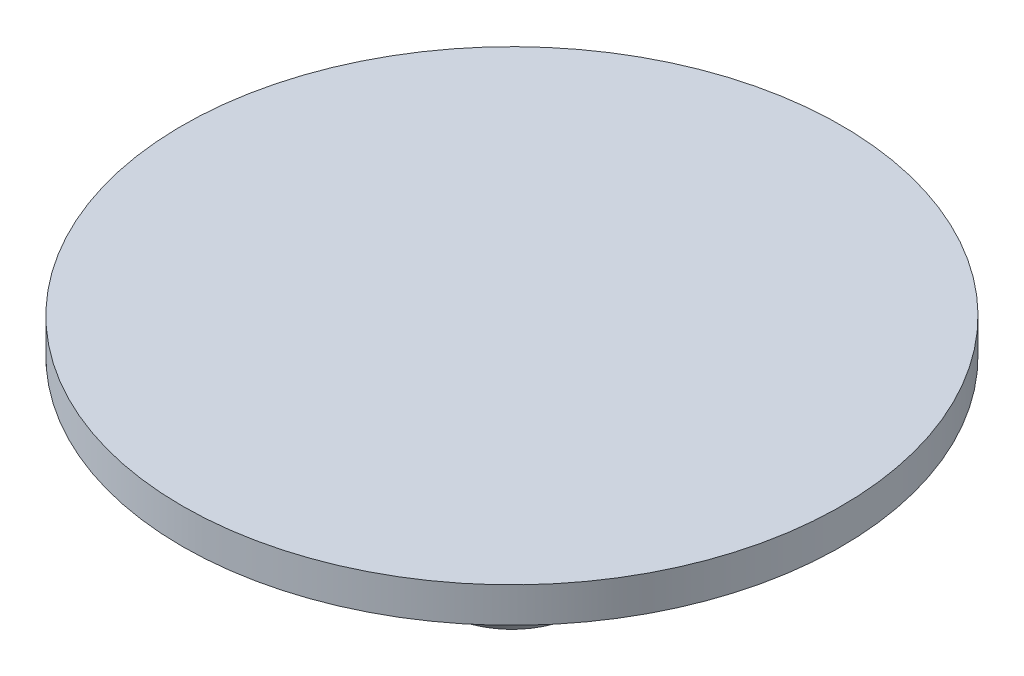
ISO-10303-21;
HEADER;
FILE_DESCRIPTION(('STEP AP214'),'2;1');
FILE_NAME('part.step','',(''),(''),'','','');
FILE_SCHEMA(('AUTOMOTIVE_DESIGN { 1 0 10303 214 1 1 1 1 }'));
ENDSEC;
DATA;
#1=APPLICATION_CONTEXT('core data for automotive mechanical design processes');
#2=APPLICATION_PROTOCOL_DEFINITION('international standard','automotive_design',2000,#1);
#3=PRODUCT_CONTEXT('',#1,'mechanical');
#4=PRODUCT('Part','Part','',(#3));
#5=PRODUCT_RELATED_PRODUCT_CATEGORY('part','',(#4));
#6=PRODUCT_DEFINITION_FORMATION('','',#4);
#7=PRODUCT_DEFINITION_CONTEXT('part definition',#1,'design');
#8=PRODUCT_DEFINITION('design','',#6,#7);
#9=PRODUCT_DEFINITION_SHAPE('','',#8);
#10=(LENGTH_UNIT() NAMED_UNIT(*) SI_UNIT(.MILLI.,.METRE.));
#11=(NAMED_UNIT(*) PLANE_ANGLE_UNIT() SI_UNIT($,.RADIAN.));
#12=(NAMED_UNIT(*) SI_UNIT($,.STERADIAN.) SOLID_ANGLE_UNIT());
#13=UNCERTAINTY_MEASURE_WITH_UNIT(LENGTH_MEASURE(1.E-05),#10,'distance_accuracy_value','');
#14=(GEOMETRIC_REPRESENTATION_CONTEXT(3) GLOBAL_UNCERTAINTY_ASSIGNED_CONTEXT((#13)) GLOBAL_UNIT_ASSIGNED_CONTEXT((#10,
#11,#12)) REPRESENTATION_CONTEXT('',''));
#15=CARTESIAN_POINT('',(0.,0.,0.));
#16=DIRECTION('',(0.,0.,1.));
#17=DIRECTION('',(1.,0.,0.));
#18=AXIS2_PLACEMENT_3D('',#15,#16,#17);
#19=CARTESIAN_POINT('',(14.1,0.,0.));
#20=DIRECTION('',(0.,-1.,0.));
#21=DIRECTION('',(0.,0.,-1.));
#22=AXIS2_PLACEMENT_3D('',#19,#20,#21);
#23=PLANE('',#22);
#24=CARTESIAN_POINT('',(0.,0.,0.));
#25=DIRECTION('',(0.,1.,0.));
#26=DIRECTION('',(0.,0.,1.));
#27=AXIS2_PLACEMENT_3D('',#24,#25,#26);
#28=CIRCLE('',#27,14.1);
#29=CARTESIAN_POINT('',(0.,0.,14.1));
#30=VERTEX_POINT('',#29);
#31=EDGE_CURVE('E68',#30,#30,#28,.T.);
#32=ORIENTED_EDGE('',*,*,#31,.T.);
#33=EDGE_LOOP('',(#32));
#34=FACE_BOUND('',#33,.T.);
#35=ADVANCED_FACE('F41',(#34),#23,.F.);
#36=CARTESIAN_POINT('',(0.,-1.5,0.));
#37=DIRECTION('',(0.,1.,0.));
#38=DIRECTION('',(0.,0.,1.));
#39=AXIS2_PLACEMENT_3D('',#36,#37,#38);
#40=PLANE('',#39);
#41=CARTESIAN_POINT('',(0.,-1.5,0.));
#42=DIRECTION('',(0.,1.,0.));
#43=DIRECTION('',(0.,0.,1.));
#44=AXIS2_PLACEMENT_3D('',#41,#42,#43);
#45=CIRCLE('',#44,2.);
#46=CARTESIAN_POINT('',(0.,-1.5,2.));
#47=VERTEX_POINT('',#46);
#48=EDGE_CURVE('E10',#47,#47,#45,.T.);
#49=ORIENTED_EDGE('',*,*,#48,.F.);
#50=EDGE_LOOP('',(#49));
#51=FACE_BOUND('',#50,.T.);
#52=ADVANCED_FACE('F104',(#51),#40,.F.);
#53=CARTESIAN_POINT('',(0.,0.,0.));
#54=DIRECTION('',(0.,1.,0.));
#55=DIRECTION('',(0.,0.,1.));
#56=AXIS2_PLACEMENT_3D('',#53,#54,#55);
#57=CYLINDRICAL_SURFACE('',#56,2.);
#58=CARTESIAN_POINT('',(1.25,-5.6,-1.5612494995996));
#59=CARTESIAN_POINT('',(1.24999462210485,-5.66212028180293,-1.56125800072559));
#60=CARTESIAN_POINT('',(1.24532693849666,-5.72433783537025,-1.56502642708837));
#61=CARTESIAN_POINT('',(1.22698950832934,-5.84667632007938,-1.57943717205478));
#62=CARTESIAN_POINT('',(1.21329530430551,-5.90679108636524,-1.59009816464115));
#63=CARTESIAN_POINT('',(1.17788073911871,-6.02278232269884,-1.61650085329041));
#64=CARTESIAN_POINT('',(1.15622993332784,-6.07869060868181,-1.63219837418033));
#65=CARTESIAN_POINT('',(1.10571945561924,-6.18600886163815,-1.66682950714432));
#66=CARTESIAN_POINT('',(1.07685958706091,-6.2374187058565,-1.68576320748676));
#67=CARTESIAN_POINT('',(1.00823937928364,-6.34186515447698,-1.72779611374711));
#68=CARTESIAN_POINT('',(0.967536093692503,-6.39419474083259,-1.75111338227346));
#69=CARTESIAN_POINT('',(0.87830866449688,-6.49188269914497,-1.79752820854877));
#70=CARTESIAN_POINT('',(0.829777781297414,-6.53723499728392,-1.82062555863329));
#71=CARTESIAN_POINT('',(0.719186665258492,-6.62510358514812,-1.86729453891009));
#72=CARTESIAN_POINT('',(0.656200568910557,-6.6666176681043,-1.8905872224145));
#73=CARTESIAN_POINT('',(0.522404070837316,-6.73812520476316,-1.9318323169914));
#74=CARTESIAN_POINT('',(0.451601506478242,-6.76813006575125,-1.94979001179838));
#75=CARTESIAN_POINT('',(0.311776878362019,-6.81248231060706,-1.97669841318201));
#76=CARTESIAN_POINT('',(0.243305636047242,-6.82811141639693,-1.98637922422038));
#77=CARTESIAN_POINT('',(0.104105100662264,-6.8476320696434,-1.99850544379202));
#78=CARTESIAN_POINT('',(0.0333782605640278,-6.85153595612055,-2.00095845843657));
#79=CARTESIAN_POINT('',(-0.0980658284213394,-6.84764431072239,-1.99852909107528));
#80=CARTESIAN_POINT('',(-0.158852523273785,-6.8413486236991,-1.99458699811902));
#81=CARTESIAN_POINT('',(-0.278306645903669,-6.82013301563668,-1.98145272261225));
#82=CARTESIAN_POINT('',(-0.336973913146973,-6.80521244276248,-1.97226014325117));
#83=CARTESIAN_POINT('',(-0.450889117077072,-6.76739622490288,-1.94938133614675));
#84=CARTESIAN_POINT('',(-0.506127875493232,-6.74448017595141,-1.93568361673912));
#85=CARTESIAN_POINT('',(-0.612019220469381,-6.69153124474001,-1.90485632889331));
#86=CARTESIAN_POINT('',(-0.66267075856,-6.6614967411094,-1.88772597874226));
#87=CARTESIAN_POINT('',(-0.764713515567041,-6.59097183467063,-1.84893224750793));
#88=CARTESIAN_POINT('',(-0.815412344918949,-6.54964537325767,-1.82697004307144));
#89=CARTESIAN_POINT('',(-0.909598595905498,-6.45986761977663,-1.78195462752237));
#90=CARTESIAN_POINT('',(-0.953075338789632,-6.41140597355345,-1.75889986449171));
#91=CARTESIAN_POINT('',(-1.03735445892931,-6.3012943770939,-1.71071442112196));
#92=CARTESIAN_POINT('',(-1.07706615479946,-6.2387486191497,-1.68570581533195));
#93=CARTESIAN_POINT('',(-1.14526153203309,-6.10635388022657,-1.640141390954));
#94=CARTESIAN_POINT('',(-1.17376589603358,-6.03651865604459,-1.6195774019168));
#95=CARTESIAN_POINT('',(-1.21218566853166,-5.91023059711213,-1.5909187656712));
#96=CARTESIAN_POINT('',(-1.22501841721721,-5.85508903736233,-1.58096704305272));
#97=CARTESIAN_POINT('',(-1.24310168537523,-5.74288481125107,-1.56679138875765));
#98=CARTESIAN_POINT('',(-1.24836256353275,-5.6858248789601,-1.56255963237428));
#99=CARTESIAN_POINT('',(-1.25098535954508,-5.57127131945973,-1.56046133530164));
#100=CARTESIAN_POINT('',(-1.24832917576576,-5.51377699863418,-1.56260938140435));
#101=CARTESIAN_POINT('',(-1.23525733555987,-5.4002194189684,-1.57296042862705));
#102=CARTESIAN_POINT('',(-1.22483525320262,-5.34415738503708,-1.58116844404657));
#103=CARTESIAN_POINT('',(-1.1970493572483,-5.2357816161342,-1.60230060601957));
#104=CARTESIAN_POINT('',(-1.17980280626788,-5.18342132666849,-1.61514477937171));
#105=CARTESIAN_POINT('',(-1.13902451938523,-5.08221266544302,-1.64415573440841));
#106=CARTESIAN_POINT('',(-1.11549055271421,-5.03336554797551,-1.66032369489908));
#107=CARTESIAN_POINT('',(-1.0576537677232,-4.93069396082297,-1.69787203988937));
#108=CARTESIAN_POINT('',(-1.02215373814221,-4.87769245875068,-1.71965875738289));
#109=CARTESIAN_POINT('',(-0.943690263224865,-4.77781494756085,-1.76393958000711));
#110=CARTESIAN_POINT('',(-0.900719074496603,-4.73094538302204,-1.78643439903354));
#111=CARTESIAN_POINT('',(-0.800380659499197,-4.63701675375685,-1.83383164018972));
#112=CARTESIAN_POINT('',(-0.741809949714167,-4.59113144299232,-1.85854204787597));
#113=CARTESIAN_POINT('',(-0.616299987869581,-4.50993134812414,-1.90384248964999));
#114=CARTESIAN_POINT('',(-0.549364678748665,-4.47461161002636,-1.92443445329132));
#115=CARTESIAN_POINT('',(-0.412925900636603,-4.41800500879736,-1.95809255957561));
#116=CARTESIAN_POINT('',(-0.343814822544522,-4.39600579352924,-1.9715348458918));
#117=CARTESIAN_POINT('',(-0.201860998884749,-4.36427333131891,-1.9910701008804));
#118=CARTESIAN_POINT('',(-0.12902356323837,-4.35452311023889,-1.99717323933003));
#119=CARTESIAN_POINT('',(0.00659907199680948,-4.34845347996121,-2.00096685748559));
#120=CARTESIAN_POINT('',(0.0692812975954716,-4.35036422321301,-1.99976600623617));
#121=CARTESIAN_POINT('',(0.193279811091723,-4.36346167497433,-1.99160739958772));
#122=CARTESIAN_POINT('',(0.254596160840741,-4.37464796257577,-1.98464990541518));
#123=CARTESIAN_POINT('',(0.372043294685524,-4.40516047487659,-1.9659610468898));
#124=CARTESIAN_POINT('',(0.428280180678306,-4.4241908398732,-1.95440367471701));
#125=CARTESIAN_POINT('',(0.536714369111312,-4.46955992816406,-1.92744968677265));
#126=CARTESIAN_POINT('',(0.588910988118237,-4.49589988447559,-1.91205242331406));
#127=CARTESIAN_POINT('',(0.693656737470665,-4.5581605789912,-1.87675342239825));
#128=CARTESIAN_POINT('',(0.74568012716221,-4.59479198131898,-1.85655002466956));
#129=CARTESIAN_POINT('',(0.843216608355412,-4.6750766303327,-1.81433640456238));
#130=CARTESIAN_POINT('',(0.888722243055228,-4.71873780024594,-1.79232415730621));
#131=CARTESIAN_POINT('',(0.978723601300804,-4.81911626230327,-1.74500415099525));
#132=CARTESIAN_POINT('',(1.02212829873816,-4.87680834517692,-1.71967871446314));
#133=CARTESIAN_POINT('',(1.09877325005744,-4.99964466601011,-1.67174821497037));
#134=CARTESIAN_POINT('',(1.132019125571,-5.06478475490759,-1.64914165167052));
#135=CARTESIAN_POINT('',(1.18099110923231,-5.18640276792966,-1.61429776080214));
#136=CARTESIAN_POINT('',(1.19896216276381,-5.24163568087936,-1.60087340349652));
#137=CARTESIAN_POINT('',(1.22712822180408,-5.35496927795719,-1.57939158437939));
#138=CARTESIAN_POINT('',(1.23734784245405,-5.41306025502414,-1.57131714400176));
#139=CARTESIAN_POINT('',(1.24559906183097,-5.49303052386285,-1.56476456389394));
#140=CARTESIAN_POINT('',(1.24724671259581,-5.51436414551699,-1.56345069546827));
#141=CARTESIAN_POINT('',(1.24944824734288,-5.55712796652148,-1.56169158695047));
#142=CARTESIAN_POINT('',(1.25000185626673,-5.57855818880168,-1.56124656529967));
#143=CARTESIAN_POINT('',(1.25,-5.6,-1.5612494995996));
#144=B_SPLINE_CURVE_WITH_KNOTS('',3,(#58,#59,#60,#61,#62,#63,#64,#65,#66,#67,#68,#69,#70,#71,
#72,#73,#74,#75,#76,#77,#78,#79,#80,#81,#82,#83,#84,#85,#86,#87,#88,#89,#90,#91,#92,#93,#94,#95,
#96,#97,#98,#99,#100,#101,#102,#103,#104,#105,#106,#107,#108,#109,#110,#111,#112,#113,#114,#115,
#116,#117,#118,#119,#120,#121,#122,#123,#124,#125,#126,#127,#128,#129,#130,#131,#132,#133,#134,
#135,#136,#137,#138,#139,#140,#141,#142,#143),.UNSPECIFIED.,.T.,.F.,(4,2,2,2,2,2,2,2,2,2,2,2,2,
2,2,2,2,2,2,2,2,2,2,2,2,2,2,2,2,2,2,2,2,2,2,2,2,2,2,2,2,2,4),(0.,0.186262444012014,
0.373031654397095,0.5582055561304,0.743384509377749,0.953406207440072,1.16360970997911,
1.39917236034456,1.6345009273926,1.84590412815398,2.05708478092387,2.23992319583511,
2.42277543076414,2.60609774825956,2.78946186128171,2.99564504832107,3.20213044016185,
3.43558067920821,3.66859805095277,3.84032775480267,4.01182230007289,4.18370925240739,
4.35573859160081,4.52493212343598,4.69418576487135,4.89566333610128,5.09735098485253,
5.33136598660889,5.56527109061626,5.78520080494549,6.00482541258961,6.19203601525124,
6.37923812308583,6.55994569114424,6.74068376037881,6.94018144108745,7.13990556958868,
7.36841817421249,7.59680409585386,7.77496902270413,7.95256577963385,8.01684109069498,
8.08113255947023),.UNSPECIFIED.);
#145=CARTESIAN_POINT('',(1.25,-5.6,-1.5612494995996));
#146=VERTEX_POINT('',#145);
#147=EDGE_CURVE('E71',#146,#146,#144,.T.);
#148=ORIENTED_EDGE('',*,*,#147,.T.);
#149=EDGE_LOOP('',(#148));
#150=FACE_BOUND('',#149,.T.);
#151=CARTESIAN_POINT('',(0.,-9.5,0.));
#152=DIRECTION('',(0.,1.,0.));
#153=DIRECTION('',(0.,0.,1.));
#154=AXIS2_PLACEMENT_3D('',#151,#152,#153);
#155=CIRCLE('',#154,2.);
#156=CARTESIAN_POINT('',(0.,-9.5,2.));
#157=VERTEX_POINT('',#156);
#158=EDGE_CURVE('E53',#157,#157,#155,.T.);
#159=ORIENTED_EDGE('',*,*,#158,.F.);
#160=EDGE_LOOP('',(#159));
#161=FACE_BOUND('',#160,.T.);
#162=ORIENTED_EDGE('',*,*,#48,.T.);
#163=EDGE_LOOP('',(#162));
#164=FACE_BOUND('',#163,.T.);
#165=ADVANCED_FACE('F77',(#150,#161,#164),#57,.F.);
#166=CARTESIAN_POINT('',(2.,-9.5,0.));
#167=DIRECTION('',(0.,1.,0.));
#168=DIRECTION('',(0.,0.,1.));
#169=AXIS2_PLACEMENT_3D('',#166,#167,#168);
#170=PLANE('',#169);
#171=CARTESIAN_POINT('',(0.,-9.5,0.));
#172=DIRECTION('',(0.,1.,0.));
#173=DIRECTION('',(0.,0.,1.));
#174=AXIS2_PLACEMENT_3D('',#171,#172,#173);
#175=CIRCLE('',#174,3.);
#176=CARTESIAN_POINT('',(0.,-9.5,3.));
#177=VERTEX_POINT('',#176);
#178=EDGE_CURVE('E57',#177,#177,#175,.T.);
#179=ORIENTED_EDGE('',*,*,#178,.F.);
#180=EDGE_LOOP('',(#179));
#181=FACE_BOUND('',#180,.T.);
#182=ORIENTED_EDGE('',*,*,#158,.T.);
#183=EDGE_LOOP('',(#182));
#184=FACE_BOUND('',#183,.T.);
#185=ADVANCED_FACE('F96',(#181,#184),#170,.F.);
#186=CARTESIAN_POINT('',(0.,-9.5,0.));
#187=DIRECTION('',(0.,1.,0.));
#188=DIRECTION('',(0.,0.,1.));
#189=AXIS2_PLACEMENT_3D('',#186,#187,#188);
#190=CONICAL_SURFACE('',#189,3.,0.448535409414174);
#191=CARTESIAN_POINT('',(-0.633272972255013,-4.52228697401176,-5.35823186437052));
#192=CARTESIAN_POINT('',(-0.698073529836136,-4.56036762859633,-5.33211884208119));
#193=CARTESIAN_POINT('',(-0.758486225275927,-4.60374841227731,-5.30267981125754));
#194=CARTESIAN_POINT('',(-0.869493991866513,-4.69896918306354,-5.23917338434889));
#195=CARTESIAN_POINT('',(-0.920064613670236,-4.75082966217172,-5.20509481060653));
#196=CARTESIAN_POINT('',(-1.01053787591356,-4.86084597158227,-5.13433728366625));
#197=CARTESIAN_POINT('',(-1.05050830111598,-4.91895828725126,-5.09767684909712));
#198=CARTESIAN_POINT('',(-1.1198967648085,-5.04033955309658,-5.02305372748598));
#199=CARTESIAN_POINT('',(-1.14931809585418,-5.10360688672274,-4.98509145083175));
#200=CARTESIAN_POINT('',(-1.20022315085262,-5.24215195822412,-4.90449500891129));
#201=CARTESIAN_POINT('',(-1.22029440709523,-5.3179518857109,-4.8618577832183));
#202=CARTESIAN_POINT('',(-1.24600509896665,-5.47294330355133,-4.77828940398834));
#203=CARTESIAN_POINT('',(-1.25163744101377,-5.55213644151251,-4.73735909874067));
#204=CARTESIAN_POINT('',(-1.2475350021621,-5.71218435238949,-4.65875136268624));
#205=CARTESIAN_POINT('',(-1.23774021533617,-5.79304440037357,-4.62108723796947));
#206=CARTESIAN_POINT('',(-1.201824404626,-5.95332956716335,-4.55082379531603));
#207=CARTESIAN_POINT('',(-1.17572101107174,-6.03275614034195,-4.51821905541381));
#208=CARTESIAN_POINT('',(-1.1108597551071,-6.17800456810315,-4.46258305524261));
#209=CARTESIAN_POINT('',(-1.07385171351673,-6.24435266926651,-4.43888793861003));
#210=CARTESIAN_POINT('',(-0.987404638645425,-6.37029296393635,-4.39681669816677));
#211=CARTESIAN_POINT('',(-0.937974105162342,-6.42988973659398,-4.37843695585536));
#212=CARTESIAN_POINT('',(-0.833925790180096,-6.53375301927921,-4.3484967837051));
#213=CARTESIAN_POINT('',(-0.780402587142492,-6.57897303985724,-4.33642202527013));
#214=CARTESIAN_POINT('',(-0.666071377951855,-6.66007405856059,-4.31596161641677));
#215=CARTESIAN_POINT('',(-0.605264598178467,-6.69595662567033,-4.30757534605328));
#216=CARTESIAN_POINT('',(-0.480219097785546,-6.75609353547438,-4.29415571542304));
#217=CARTESIAN_POINT('',(-0.416150336280492,-6.78068051501737,-4.28902447100437));
#218=CARTESIAN_POINT('',(-0.284716120805977,-6.81906659860736,-4.28123694564868));
#219=CARTESIAN_POINT('',(-0.217350704198523,-6.83286582488521,-4.27858063666929));
#220=CARTESIAN_POINT('',(-0.0809648218385251,-6.84927194656053,-4.2754403713344));
#221=CARTESIAN_POINT('',(-0.0119390915578558,-6.85183662340395,-4.27496460899252));
#222=CARTESIAN_POINT('',(0.125578228202732,-6.84557927039958,-4.27614892769292));
#223=CARTESIAN_POINT('',(0.194069800148514,-6.83675686833218,-4.27780907855371));
#224=CARTESIAN_POINT('',(0.328788252808557,-6.80795569100774,-4.2834717651111));
#225=CARTESIAN_POINT('',(0.395007544021608,-6.78794278450737,-4.28748146878891));
#226=CARTESIAN_POINT('',(0.523054621012514,-6.7373876998044,-4.29825914027059));
#227=CARTESIAN_POINT('',(0.584882720069472,-6.70684627364572,-4.30502691107417));
#228=CARTESIAN_POINT('',(0.702111924553904,-6.63643272856477,-4.32179807784406));
#229=CARTESIAN_POINT('',(0.757540331929508,-6.59660261541722,-4.33178698265518));
#230=CARTESIAN_POINT('',(0.860747507332905,-6.50895359459199,-4.35546979666827));
#231=CARTESIAN_POINT('',(0.908527174419579,-6.46113562718604,-4.36916326991296));
#232=CARTESIAN_POINT('',(0.995209423493564,-6.35929239361151,-4.40050088773576));
#233=CARTESIAN_POINT('',(1.03412310904123,-6.30527502042766,-4.41814003532771));
#234=CARTESIAN_POINT('',(1.10243533067946,-6.192845943014,-4.45734833240038));
#235=CARTESIAN_POINT('',(1.13183248244275,-6.13443360098959,-4.47891805293122));
#236=CARTESIAN_POINT('',(1.18176537159059,-6.01281019297524,-4.5265249690589));
#237=CARTESIAN_POINT('',(1.20193144734462,-5.94950147521728,-4.55269833355381));
#238=CARTESIAN_POINT('',(1.231898338909,-5.82187631272,-4.60828619031985));
#239=CARTESIAN_POINT('',(1.24169505973582,-5.75755948003142,-4.63770195799565));
#240=CARTESIAN_POINT('',(1.25177779274324,-5.62308594834988,-4.70199256657165));
#241=CARTESIAN_POINT('',(1.2510387668508,-5.55297399128603,-4.73711991680763));
#242=CARTESIAN_POINT('',(1.23814985980037,-5.4147761719484,-4.80921076367082));
#243=CARTESIAN_POINT('',(1.22599435460387,-5.34669132533514,-4.84617515676997));
#244=CARTESIAN_POINT('',(1.18877080961507,-5.2060273679783,-4.92512257661873));
#245=CARTESIAN_POINT('',(1.16236556095994,-5.13384634816223,-4.96718933962205));
#246=CARTESIAN_POINT('',(1.09655553946892,-4.99504419461867,-5.05050421687509));
#247=CARTESIAN_POINT('',(1.05713835515358,-4.92842844566084,-5.09175150949014));
#248=CARTESIAN_POINT('',(0.964050907254399,-4.80024489988539,-5.17297450426914));
#249=CARTESIAN_POINT('',(0.9099147627694,-4.73894849914857,-5.21284953403029));
#250=CARTESIAN_POINT('',(0.788710938170688,-4.62674758792375,-5.28714996149504));
#251=CARTESIAN_POINT('',(0.721671003238993,-4.57582125513382,-5.32158676811504));
#252=CARTESIAN_POINT('',(0.597444977657487,-4.50037173605997,-5.37322444448373));
#253=CARTESIAN_POINT('',(0.543156175497193,-4.47248785187128,-5.39251613502021));
#254=CARTESIAN_POINT('',(0.429711596375994,-4.42457308808223,-5.42586769694586));
#255=CARTESIAN_POINT('',(0.370560007364469,-4.40453553500669,-5.43993201381012));
#256=CARTESIAN_POINT('',(0.248476786044557,-4.37331799020304,-5.46191481981644));
#257=CARTESIAN_POINT('',(0.185526094569561,-4.36218749028236,-5.46979896410822));
#258=CARTESIAN_POINT('',(0.058171766625421,-4.34971858958022,-5.47863437261481));
#259=CARTESIAN_POINT('',(-0.00623151527147775,-4.34837782455964,-5.47958731072855));
#260=CARTESIAN_POINT('',(-0.128241498741197,-4.35523463140365,-5.47472535270889));
#261=CARTESIAN_POINT('',(-0.185925642821439,-4.36256103322665,-5.46952857301485));
#262=CARTESIAN_POINT('',(-0.298979862953674,-4.38491645859566,-5.4537402242487));
#263=CARTESIAN_POINT('',(-0.354351083309515,-4.39994162322147,-5.44315135791716));
#264=CARTESIAN_POINT('',(-0.447690806793906,-4.43216091205936,-5.42059197406891));
#265=CARTESIAN_POINT('',(-0.486469831389701,-4.44780096213072,-5.40967886007228));
#266=CARTESIAN_POINT('',(-0.561687095104626,-4.48253671552853,-5.38558052536466));
#267=CARTESIAN_POINT('',(-0.598125471472989,-4.50163221598572,-5.37239543804327));
#268=CARTESIAN_POINT('',(-0.633272972255013,-4.52228697401176,-5.35823186437052));
#269=B_SPLINE_CURVE_WITH_KNOTS('',3,(#191,#192,#193,#194,#195,#196,#197,#198,#199,#200,#201,
#202,#203,#204,#205,#206,#207,#208,#209,#210,#211,#212,#213,#214,#215,#216,#217,#218,#219,#220,
#221,#222,#223,#224,#225,#226,#227,#228,#229,#230,#231,#232,#233,#234,#235,#236,#237,#238,#239,
#240,#241,#242,#243,#244,#245,#246,#247,#248,#249,#250,#251,#252,#253,#254,#255,#256,#257,#258,
#259,#260,#261,#262,#263,#264,#265,#266,#267,#268),.UNSPECIFIED.,.T.,.F.,(4,2,2,2,2,2,2,2,2,2,2,
2,2,2,2,2,2,2,2,2,2,2,2,2,2,2,2,2,2,2,2,2,2,2,2,2,2,2,4),(0.,0.238524652663619,
0.477634481741094,0.715176251260272,0.95264381519384,1.21917931120099,1.48584572628338,
1.75355194104239,2.02096925303166,2.25836243915781,2.49559363472405,2.70784026315339,
2.92005120444353,3.12553323995881,3.33101294722199,3.53726417225163,3.7435221393701,
3.95041265572917,4.15728839712153,4.36324613986586,4.56917965583445,4.77485382990024,
4.98055790903117,5.19390181659815,5.40732994485246,5.64165350680709,5.87609256289213,
6.13779438658072,6.39974656024855,6.6712175735635,6.94211127349553,7.13336538776051,
7.32445648108344,7.51660213448741,7.70870138282438,7.88302430039435,8.05725992587039,
8.18664210706933,8.31601669471128),.UNSPECIFIED.);
#270=CARTESIAN_POINT('',(-0.633272972255013,-4.52228697401176,-5.35823186437052));
#271=VERTEX_POINT('',#270);
#272=EDGE_CURVE('E44',#271,#271,#269,.T.);
#273=ORIENTED_EDGE('',*,*,#272,.T.);
#274=EDGE_LOOP('',(#273));
#275=FACE_BOUND('',#274,.T.);
#276=CARTESIAN_POINT('',(0.,-1.5,0.));
#277=DIRECTION('',(0.,1.,0.));
#278=DIRECTION('',(0.,0.,1.));
#279=AXIS2_PLACEMENT_3D('',#276,#277,#278);
#280=CIRCLE('',#279,6.85);
#281=CARTESIAN_POINT('',(0.,-1.5,6.85));
#282=VERTEX_POINT('',#281);
#283=EDGE_CURVE('E62',#282,#282,#280,.T.);
#284=ORIENTED_EDGE('',*,*,#283,.F.);
#285=EDGE_LOOP('',(#284));
#286=FACE_BOUND('',#285,.T.);
#287=ORIENTED_EDGE('',*,*,#178,.T.);
#288=EDGE_LOOP('',(#287));
#289=FACE_BOUND('',#288,.T.);
#290=ADVANCED_FACE('F92',(#275,#286,#289),#190,.T.);
#291=CARTESIAN_POINT('',(6.85,-1.5,0.));
#292=DIRECTION('',(0.,1.,0.));
#293=DIRECTION('',(0.,0.,1.));
#294=AXIS2_PLACEMENT_3D('',#291,#292,#293);
#295=PLANE('',#294);
#296=CARTESIAN_POINT('',(0.,-1.5,0.));
#297=DIRECTION('',(0.,1.,0.));
#298=DIRECTION('',(0.,0.,1.));
#299=AXIS2_PLACEMENT_3D('',#296,#297,#298);
#300=CIRCLE('',#299,14.1);
#301=CARTESIAN_POINT('',(0.,-1.5,14.1));
#302=VERTEX_POINT('',#301);
#303=EDGE_CURVE('E65',#302,#302,#300,.T.);
#304=ORIENTED_EDGE('',*,*,#303,.F.);
#305=EDGE_LOOP('',(#304));
#306=FACE_BOUND('',#305,.T.);
#307=ORIENTED_EDGE('',*,*,#283,.T.);
#308=EDGE_LOOP('',(#307));
#309=FACE_BOUND('',#308,.T.);
#310=ADVANCED_FACE('F89',(#306,#309),#295,.F.);
#311=CARTESIAN_POINT('',(0.,0.,0.));
#312=DIRECTION('',(0.,1.,0.));
#313=DIRECTION('',(0.,0.,1.));
#314=AXIS2_PLACEMENT_3D('',#311,#312,#313);
#315=CYLINDRICAL_SURFACE('',#314,14.1);
#316=ORIENTED_EDGE('',*,*,#31,.F.);
#317=EDGE_LOOP('',(#316));
#318=FACE_BOUND('',#317,.T.);
#319=ORIENTED_EDGE('',*,*,#303,.T.);
#320=EDGE_LOOP('',(#319));
#321=FACE_BOUND('',#320,.T.);
#322=ADVANCED_FACE('F84',(#318,#321),#315,.T.);
#323=CARTESIAN_POINT('',(0.,-5.6,-10.));
#324=DIRECTION('',(0.,0.,1.));
#325=DIRECTION('',(1.,0.,0.));
#326=AXIS2_PLACEMENT_3D('',#323,#324,#325);
#327=CYLINDRICAL_SURFACE('',#326,1.25);
#328=ORIENTED_EDGE('',*,*,#272,.F.);
#329=EDGE_LOOP('',(#328));
#330=FACE_BOUND('',#329,.T.);
#331=ORIENTED_EDGE('',*,*,#147,.F.);
#332=EDGE_LOOP('',(#331));
#333=FACE_BOUND('',#332,.T.);
#334=ADVANCED_FACE('F80',(#330,#333),#327,.F.);
#335=CLOSED_SHELL('',(#35,#52,#165,#185,#290,#310,#322,#334));
#336=MANIFOLD_SOLID_BREP('B2',#335);
#337=ADVANCED_BREP_SHAPE_REPRESENTATION('',(#18,#336),#14);
#338=SHAPE_DEFINITION_REPRESENTATION(#9,#337);
ENDSEC;
END-ISO-10303-21;
